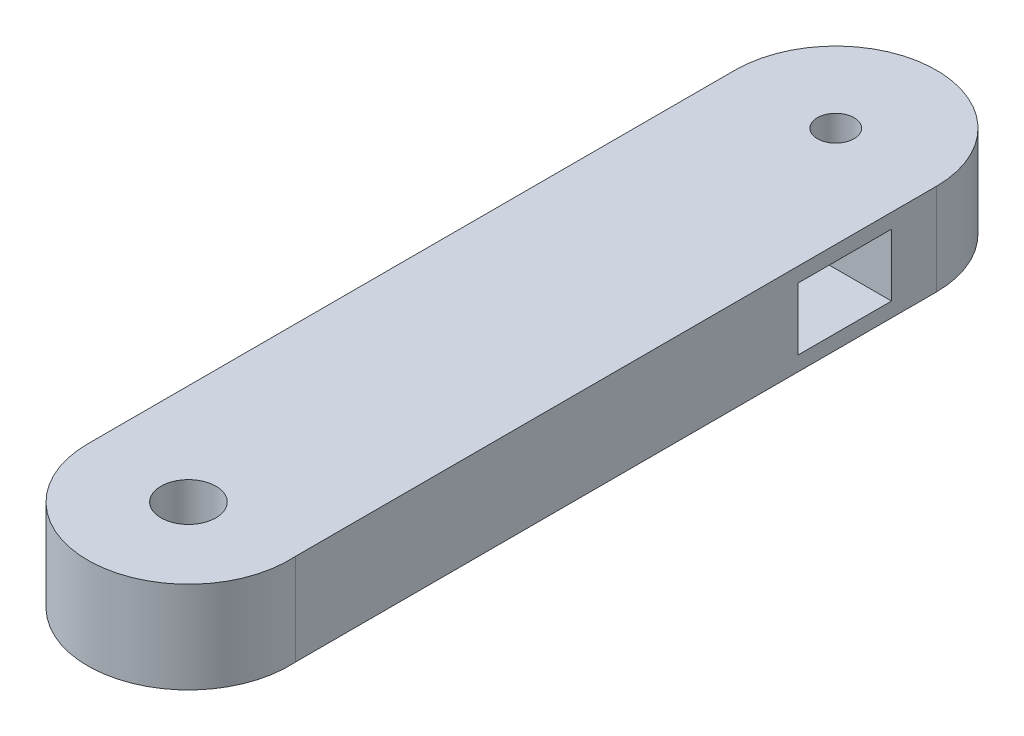
ISO-10303-21;
HEADER;
FILE_DESCRIPTION(('STEP AP214'),'2;1');
FILE_NAME('part.step','',(''),(''),'','','');
FILE_SCHEMA(('AUTOMOTIVE_DESIGN { 1 0 10303 214 1 1 1 1 }'));
ENDSEC;
DATA;
#1=APPLICATION_CONTEXT('core data for automotive mechanical design processes');
#2=APPLICATION_PROTOCOL_DEFINITION('international standard','automotive_design',2000,#1);
#3=PRODUCT_CONTEXT('',#1,'mechanical');
#4=PRODUCT('Part','Part','',(#3));
#5=PRODUCT_RELATED_PRODUCT_CATEGORY('part','',(#4));
#6=PRODUCT_DEFINITION_FORMATION('','',#4);
#7=PRODUCT_DEFINITION_CONTEXT('part definition',#1,'design');
#8=PRODUCT_DEFINITION('design','',#6,#7);
#9=PRODUCT_DEFINITION_SHAPE('','',#8);
#10=(LENGTH_UNIT() NAMED_UNIT(*) SI_UNIT(.MILLI.,.METRE.));
#11=(NAMED_UNIT(*) PLANE_ANGLE_UNIT() SI_UNIT($,.RADIAN.));
#12=(NAMED_UNIT(*) SI_UNIT($,.STERADIAN.) SOLID_ANGLE_UNIT());
#13=UNCERTAINTY_MEASURE_WITH_UNIT(LENGTH_MEASURE(1.E-05),#10,'distance_accuracy_value','');
#14=(GEOMETRIC_REPRESENTATION_CONTEXT(3) GLOBAL_UNCERTAINTY_ASSIGNED_CONTEXT((#13)) GLOBAL_UNIT_ASSIGNED_CONTEXT((#10,
#11,#12)) REPRESENTATION_CONTEXT('',''));
#15=CARTESIAN_POINT('',(0.,0.,0.));
#16=DIRECTION('',(0.,0.,1.));
#17=DIRECTION('',(1.,0.,0.));
#18=AXIS2_PLACEMENT_3D('',#15,#16,#17);
#19=CARTESIAN_POINT('',(0.,0.,0.));
#20=DIRECTION('',(0.,-1.,0.));
#21=DIRECTION('',(0.,0.,-1.));
#22=AXIS2_PLACEMENT_3D('',#19,#20,#21);
#23=CYLINDRICAL_SURFACE('',#22,5.5);
#24=CARTESIAN_POINT('',(0.,0.,0.));
#25=DIRECTION('',(0.,-1.,0.));
#26=DIRECTION('',(0.,0.,-1.));
#27=AXIS2_PLACEMENT_3D('',#24,#25,#26);
#28=CIRCLE('',#27,5.5);
#29=CARTESIAN_POINT('',(5.48924730154326,0.,-0.343750000000009));
#30=VERTEX_POINT('',#29);
#31=CARTESIAN_POINT('',(-5.5,0.,0.));
#32=VERTEX_POINT('',#31);
#33=EDGE_CURVE('E11',#30,#32,#28,.T.);
#34=ORIENTED_EDGE('',*,*,#33,.F.);
#35=DIRECTION('',(0.,-1.,0.));
#36=VECTOR('',#35,1.);
#37=CARTESIAN_POINT('',(5.48924730154326,47.2910902991932,-0.34375));
#38=LINE('',#37,#36);
#39=CARTESIAN_POINT('',(5.48924730154326,5.,-0.34375));
#40=VERTEX_POINT('',#39);
#41=EDGE_CURVE('E152',#40,#30,#38,.T.);
#42=ORIENTED_EDGE('',*,*,#41,.F.);
#43=CARTESIAN_POINT('',(0.,5.,0.));
#44=DIRECTION('',(0.,-1.,0.));
#45=DIRECTION('',(0.,0.,-1.));
#46=AXIS2_PLACEMENT_3D('',#43,#44,#45);
#47=CIRCLE('',#46,5.5);
#48=CARTESIAN_POINT('',(-5.5,5.,0.));
#49=VERTEX_POINT('',#48);
#50=EDGE_CURVE('E43',#40,#49,#47,.T.);
#51=ORIENTED_EDGE('',*,*,#50,.T.);
#52=DIRECTION('',(0.,-1.,0.));
#53=VECTOR('',#52,1.);
#54=CARTESIAN_POINT('',(-5.5,47.2910902991932,0.));
#55=LINE('',#54,#53);
#56=EDGE_CURVE('E148',#49,#32,#55,.T.);
#57=ORIENTED_EDGE('',*,*,#56,.T.);
#58=EDGE_LOOP('',(#34,#42,#51,#57));
#59=FACE_BOUND('',#58,.T.);
#60=ADVANCED_FACE('F34',(#59),#23,.T.);
#61=CARTESIAN_POINT('',(-2.4,0.,0.));
#62=DIRECTION('',(0.,1.,0.));
#63=DIRECTION('',(0.,0.,1.));
#64=AXIS2_PLACEMENT_3D('',#61,#62,#63);
#65=PLANE('',#64);
#66=CARTESIAN_POINT('',(-0.00537634922836809,0.,-35.34375));
#67=DIRECTION('',(0.,1.,0.));
#68=DIRECTION('',(0.,0.,1.));
#69=AXIS2_PLACEMENT_3D('',#66,#67,#68);
#70=CIRCLE('',#69,1.);
#71=CARTESIAN_POINT('',(-0.00537634922836809,0.,-34.34375));
#72=VERTEX_POINT('',#71);
#73=EDGE_CURVE('E38',#72,#72,#70,.F.);
#74=ORIENTED_EDGE('',*,*,#73,.F.);
#75=EDGE_LOOP('',(#74));
#76=FACE_BOUND('',#75,.T.);
#77=CARTESIAN_POINT('',(0.,0.,0.));
#78=DIRECTION('',(0.,-1.,0.));
#79=DIRECTION('',(0.,0.,-1.));
#80=AXIS2_PLACEMENT_3D('',#77,#78,#79);
#81=CIRCLE('',#80,1.5);
#82=CARTESIAN_POINT('',(0.,0.,-1.5));
#83=VERTEX_POINT('',#82);
#84=EDGE_CURVE('E163',#83,#83,#81,.T.);
#85=ORIENTED_EDGE('',*,*,#84,.F.);
#86=EDGE_LOOP('',(#85));
#87=FACE_BOUND('',#86,.T.);
#88=ORIENTED_EDGE('',*,*,#33,.T.);
#89=DIRECTION('',(0.,0.,1.));
#90=VECTOR('',#89,1.);
#91=CARTESIAN_POINT('',(-5.5,0.,0.));
#92=LINE('',#91,#90);
#93=CARTESIAN_POINT('',(-5.5,0.,-35.34375));
#94=VERTEX_POINT('',#93);
#95=EDGE_CURVE('E139',#94,#32,#92,.T.);
#96=ORIENTED_EDGE('',*,*,#95,.F.);
#97=CARTESIAN_POINT('',(-0.00537634922836809,0.,-35.34375));
#98=DIRECTION('',(0.,1.,0.));
#99=DIRECTION('',(0.,0.,1.));
#100=AXIS2_PLACEMENT_3D('',#97,#98,#99);
#101=CIRCLE('',#100,5.49462365077163);
#102=CARTESIAN_POINT('',(5.48924730154326,0.,-35.34375));
#103=VERTEX_POINT('',#102);
#104=EDGE_CURVE('E136',#103,#94,#101,.T.);
#105=ORIENTED_EDGE('',*,*,#104,.F.);
#106=DIRECTION('',(0.,0.,-1.));
#107=VECTOR('',#106,1.);
#108=CARTESIAN_POINT('',(5.48924730154326,0.,-0.34375));
#109=LINE('',#108,#107);
#110=EDGE_CURVE('E140',#30,#103,#109,.T.);
#111=ORIENTED_EDGE('',*,*,#110,.F.);
#112=EDGE_LOOP('',(#88,#96,#105,#111));
#113=FACE_BOUND('',#112,.T.);
#114=ADVANCED_FACE('F36',(#76,#87,#113),#65,.F.);
#115=CARTESIAN_POINT('',(-4.25,5.,0.));
#116=DIRECTION('',(0.,-1.,0.));
#117=DIRECTION('',(0.,0.,-1.));
#118=AXIS2_PLACEMENT_3D('',#115,#116,#117);
#119=PLANE('',#118);
#120=CARTESIAN_POINT('',(-0.00537634922836809,5.,-35.34375));
#121=DIRECTION('',(0.,-1.,0.));
#122=DIRECTION('',(0.,0.,-1.));
#123=AXIS2_PLACEMENT_3D('',#120,#121,#122);
#124=CIRCLE('',#123,1.);
#125=CARTESIAN_POINT('',(-0.00537634922836809,5.,-36.34375));
#126=VERTEX_POINT('',#125);
#127=EDGE_CURVE('E143',#126,#126,#124,.T.);
#128=ORIENTED_EDGE('',*,*,#127,.T.);
#129=EDGE_LOOP('',(#128));
#130=FACE_BOUND('',#129,.T.);
#131=ORIENTED_EDGE('',*,*,#50,.F.);
#132=DIRECTION('',(0.,0.,-1.));
#133=VECTOR('',#132,1.);
#134=CARTESIAN_POINT('',(5.48924730154326,5.,-0.34375));
#135=LINE('',#134,#133);
#136=CARTESIAN_POINT('',(5.48924730154326,5.,-35.34375));
#137=VERTEX_POINT('',#136);
#138=EDGE_CURVE('E151',#40,#137,#135,.T.);
#139=ORIENTED_EDGE('',*,*,#138,.T.);
#140=CARTESIAN_POINT('',(-0.00537634922836809,5.,-35.34375));
#141=DIRECTION('',(0.,-1.,0.));
#142=DIRECTION('',(0.,0.,-1.));
#143=AXIS2_PLACEMENT_3D('',#140,#141,#142);
#144=CIRCLE('',#143,5.49462365077163);
#145=CARTESIAN_POINT('',(-5.5,5.00000000000001,-35.34375));
#146=VERTEX_POINT('',#145);
#147=EDGE_CURVE('E149',#137,#146,#144,.F.);
#148=ORIENTED_EDGE('',*,*,#147,.T.);
#149=DIRECTION('',(0.,0.,1.));
#150=VECTOR('',#149,1.);
#151=CARTESIAN_POINT('',(-5.5,5.,0.));
#152=LINE('',#151,#150);
#153=EDGE_CURVE('E154',#146,#49,#152,.T.);
#154=ORIENTED_EDGE('',*,*,#153,.T.);
#155=EDGE_LOOP('',(#131,#139,#148,#154));
#156=FACE_BOUND('',#155,.T.);
#157=CARTESIAN_POINT('',(0.,5.,0.));
#158=DIRECTION('',(0.,-1.,0.));
#159=DIRECTION('',(0.,0.,-1.));
#160=AXIS2_PLACEMENT_3D('',#157,#158,#159);
#161=CIRCLE('',#160,1.5);
#162=CARTESIAN_POINT('',(0.,5.,-1.5));
#163=VERTEX_POINT('',#162);
#164=EDGE_CURVE('E166',#163,#163,#161,.T.);
#165=ORIENTED_EDGE('',*,*,#164,.T.);
#166=EDGE_LOOP('',(#165));
#167=FACE_BOUND('',#166,.T.);
#168=ADVANCED_FACE('F176',(#130,#156,#167),#119,.F.);
#169=CARTESIAN_POINT('',(0.,0.,0.));
#170=DIRECTION('',(0.,-1.,0.));
#171=DIRECTION('',(0.,0.,-1.));
#172=AXIS2_PLACEMENT_3D('',#169,#170,#171);
#173=CYLINDRICAL_SURFACE('',#172,1.5);
#174=ORIENTED_EDGE('',*,*,#164,.F.);
#175=EDGE_LOOP('',(#174));
#176=FACE_BOUND('',#175,.T.);
#177=ORIENTED_EDGE('',*,*,#84,.T.);
#178=EDGE_LOOP('',(#177));
#179=FACE_BOUND('',#178,.T.);
#180=ADVANCED_FACE('F190',(#176,#179),#173,.F.);
#181=CARTESIAN_POINT('',(5.48924730154326,47.2910902991932,-0.34375));
#182=DIRECTION('',(1.,0.,0.));
#183=DIRECTION('',(0.,0.,-1.));
#184=AXIS2_PLACEMENT_3D('',#181,#182,#183);
#185=PLANE('',#184);
#186=DIRECTION('',(0.,-1.,0.));
#187=VECTOR('',#186,1.);
#188=CARTESIAN_POINT('',(5.48924730154326,4.19999999999999,-27.79375));
#189=LINE('',#188,#187);
#190=CARTESIAN_POINT('',(5.48924730154326,4.19999999999999,-27.79375));
#191=VERTEX_POINT('',#190);
#192=CARTESIAN_POINT('',(5.48924730154326,0.799999999999997,-27.79375));
#193=VERTEX_POINT('',#192);
#194=EDGE_CURVE('E50',#191,#193,#189,.T.);
#195=ORIENTED_EDGE('',*,*,#194,.F.);
#196=DIRECTION('',(0.,0.,1.));
#197=VECTOR('',#196,1.);
#198=CARTESIAN_POINT('',(5.48924730154326,4.19999999999999,-32.89375));
#199=LINE('',#198,#197);
#200=CARTESIAN_POINT('',(5.48924730154326,4.19999999999999,-32.89375));
#201=VERTEX_POINT('',#200);
#202=EDGE_CURVE('E118',#201,#191,#199,.T.);
#203=ORIENTED_EDGE('',*,*,#202,.F.);
#204=DIRECTION('',(0.,1.,0.));
#205=VECTOR('',#204,1.);
#206=CARTESIAN_POINT('',(5.48924730154326,4.19999999999999,-32.89375));
#207=LINE('',#206,#205);
#208=CARTESIAN_POINT('',(5.48924730154326,0.799999999999993,-32.89375));
#209=VERTEX_POINT('',#208);
#210=EDGE_CURVE('E121',#209,#201,#207,.T.);
#211=ORIENTED_EDGE('',*,*,#210,.F.);
#212=DIRECTION('',(0.,0.,-1.));
#213=VECTOR('',#212,1.);
#214=CARTESIAN_POINT('',(5.48924730154326,0.799999999999993,-32.89375));
#215=LINE('',#214,#213);
#216=EDGE_CURVE('E127',#193,#209,#215,.T.);
#217=ORIENTED_EDGE('',*,*,#216,.F.);
#218=EDGE_LOOP('',(#195,#203,#211,#217));
#219=FACE_BOUND('',#218,.T.);
#220=ORIENTED_EDGE('',*,*,#138,.F.);
#221=ORIENTED_EDGE('',*,*,#41,.T.);
#222=ORIENTED_EDGE('',*,*,#110,.T.);
#223=DIRECTION('',(0.,-1.,0.));
#224=VECTOR('',#223,1.);
#225=CARTESIAN_POINT('',(5.48924730154326,47.2910902991932,-35.34375));
#226=LINE('',#225,#224);
#227=EDGE_CURVE('E156',#137,#103,#226,.T.);
#228=ORIENTED_EDGE('',*,*,#227,.F.);
#229=EDGE_LOOP('',(#220,#221,#222,#228));
#230=FACE_BOUND('',#229,.T.);
#231=ADVANCED_FACE('F188',(#219,#230),#185,.T.);
#232=CARTESIAN_POINT('',(-0.00537634922836809,47.2910902991932,-35.34375));
#233=DIRECTION('',(0.,-1.,0.));
#234=DIRECTION('',(0.,0.,-1.));
#235=AXIS2_PLACEMENT_3D('',#232,#233,#234);
#236=CYLINDRICAL_SURFACE('',#235,5.49462365077163);
#237=ORIENTED_EDGE('',*,*,#147,.F.);
#238=ORIENTED_EDGE('',*,*,#227,.T.);
#239=ORIENTED_EDGE('',*,*,#104,.T.);
#240=DIRECTION('',(0.,-1.,0.));
#241=VECTOR('',#240,1.);
#242=CARTESIAN_POINT('',(-5.5,47.2910902991932,-35.34375));
#243=LINE('',#242,#241);
#244=EDGE_CURVE('E158',#146,#94,#243,.T.);
#245=ORIENTED_EDGE('',*,*,#244,.F.);
#246=EDGE_LOOP('',(#237,#238,#239,#245));
#247=FACE_BOUND('',#246,.T.);
#248=ADVANCED_FACE('F185',(#247),#236,.T.);
#249=CARTESIAN_POINT('',(-5.5,47.2910902991932,0.));
#250=DIRECTION('',(-1.,0.,0.));
#251=DIRECTION('',(0.,0.,1.));
#252=AXIS2_PLACEMENT_3D('',#249,#250,#251);
#253=PLANE('',#252);
#254=DIRECTION('',(0.,-1.,0.));
#255=VECTOR('',#254,1.);
#256=CARTESIAN_POINT('',(-5.5,4.19999999999999,-27.79375));
#257=LINE('',#256,#255);
#258=CARTESIAN_POINT('',(-5.5,4.19999999999999,-27.79375));
#259=VERTEX_POINT('',#258);
#260=CARTESIAN_POINT('',(-5.5,0.799999999999993,-27.79375));
#261=VERTEX_POINT('',#260);
#262=EDGE_CURVE('E102',#259,#261,#257,.T.);
#263=ORIENTED_EDGE('',*,*,#262,.T.);
#264=DIRECTION('',(0.,0.,-1.));
#265=VECTOR('',#264,1.);
#266=CARTESIAN_POINT('',(-5.5,0.799999999999993,-32.89375));
#267=LINE('',#266,#265);
#268=CARTESIAN_POINT('',(-5.5,0.799999999999998,-32.89375));
#269=VERTEX_POINT('',#268);
#270=EDGE_CURVE('E111',#261,#269,#267,.T.);
#271=ORIENTED_EDGE('',*,*,#270,.T.);
#272=DIRECTION('',(0.,1.,0.));
#273=VECTOR('',#272,1.);
#274=CARTESIAN_POINT('',(-5.5,4.19999999999999,-32.89375));
#275=LINE('',#274,#273);
#276=CARTESIAN_POINT('',(-5.5,4.19999999999999,-32.89375));
#277=VERTEX_POINT('',#276);
#278=EDGE_CURVE('E58',#269,#277,#275,.T.);
#279=ORIENTED_EDGE('',*,*,#278,.T.);
#280=DIRECTION('',(0.,0.,1.));
#281=VECTOR('',#280,1.);
#282=CARTESIAN_POINT('',(-5.5,4.19999999999999,-32.89375));
#283=LINE('',#282,#281);
#284=EDGE_CURVE('E108',#277,#259,#283,.T.);
#285=ORIENTED_EDGE('',*,*,#284,.T.);
#286=EDGE_LOOP('',(#263,#271,#279,#285));
#287=FACE_BOUND('',#286,.T.);
#288=ORIENTED_EDGE('',*,*,#153,.F.);
#289=ORIENTED_EDGE('',*,*,#244,.T.);
#290=ORIENTED_EDGE('',*,*,#95,.T.);
#291=ORIENTED_EDGE('',*,*,#56,.F.);
#292=EDGE_LOOP('',(#288,#289,#290,#291));
#293=FACE_BOUND('',#292,.T.);
#294=ADVANCED_FACE('F115',(#287,#293),#253,.T.);
#295=CARTESIAN_POINT('',(-0.00537634922836809,7.,-35.34375));
#296=DIRECTION('',(0.,-1.,0.));
#297=DIRECTION('',(0.,0.,-1.));
#298=AXIS2_PLACEMENT_3D('',#295,#296,#297);
#299=CYLINDRICAL_SURFACE('',#298,1.);
#300=ORIENTED_EDGE('',*,*,#127,.F.);
#301=EDGE_LOOP('',(#300));
#302=FACE_BOUND('',#301,.T.);
#303=ORIENTED_EDGE('',*,*,#73,.T.);
#304=EDGE_LOOP('',(#303));
#305=FACE_BOUND('',#304,.T.);
#306=ADVANCED_FACE('F211',(#302,#305),#299,.F.);
#307=CARTESIAN_POINT('',(-5.5,4.19999999999999,-27.79375));
#308=DIRECTION('',(0.,0.,1.));
#309=DIRECTION('',(1.,0.,0.));
#310=AXIS2_PLACEMENT_3D('',#307,#308,#309);
#311=PLANE('',#310);
#312=ORIENTED_EDGE('',*,*,#194,.T.);
#313=DIRECTION('',(1.,0.,0.));
#314=VECTOR('',#313,1.);
#315=CARTESIAN_POINT('',(-5.5,0.799999999999993,-27.79375));
#316=LINE('',#315,#314);
#317=EDGE_CURVE('E98',#261,#193,#316,.T.);
#318=ORIENTED_EDGE('',*,*,#317,.F.);
#319=ORIENTED_EDGE('',*,*,#262,.F.);
#320=DIRECTION('',(1.,0.,0.));
#321=VECTOR('',#320,1.);
#322=CARTESIAN_POINT('',(-5.5,4.19999999999999,-27.79375));
#323=LINE('',#322,#321);
#324=EDGE_CURVE('E131',#259,#191,#323,.T.);
#325=ORIENTED_EDGE('',*,*,#324,.T.);
#326=EDGE_LOOP('',(#312,#318,#319,#325));
#327=FACE_BOUND('',#326,.T.);
#328=ADVANCED_FACE('F100',(#327),#311,.F.);
#329=CARTESIAN_POINT('',(-5.5,4.19999999999999,-32.89375));
#330=DIRECTION('',(0.,1.,0.));
#331=DIRECTION('',(0.,0.,1.));
#332=AXIS2_PLACEMENT_3D('',#329,#330,#331);
#333=PLANE('',#332);
#334=ORIENTED_EDGE('',*,*,#202,.T.);
#335=ORIENTED_EDGE('',*,*,#324,.F.);
#336=ORIENTED_EDGE('',*,*,#284,.F.);
#337=DIRECTION('',(1.,0.,0.));
#338=VECTOR('',#337,1.);
#339=CARTESIAN_POINT('',(-5.5,4.19999999999999,-32.89375));
#340=LINE('',#339,#338);
#341=EDGE_CURVE('E133',#277,#201,#340,.T.);
#342=ORIENTED_EDGE('',*,*,#341,.T.);
#343=EDGE_LOOP('',(#334,#335,#336,#342));
#344=FACE_BOUND('',#343,.T.);
#345=ADVANCED_FACE('F219',(#344),#333,.F.);
#346=CARTESIAN_POINT('',(-5.5,4.19999999999999,-32.89375));
#347=DIRECTION('',(0.,0.,-1.));
#348=DIRECTION('',(-1.,0.,0.));
#349=AXIS2_PLACEMENT_3D('',#346,#347,#348);
#350=PLANE('',#349);
#351=ORIENTED_EDGE('',*,*,#210,.T.);
#352=ORIENTED_EDGE('',*,*,#341,.F.);
#353=ORIENTED_EDGE('',*,*,#278,.F.);
#354=DIRECTION('',(1.,0.,0.));
#355=VECTOR('',#354,1.);
#356=CARTESIAN_POINT('',(-5.5,0.799999999999993,-32.89375));
#357=LINE('',#356,#355);
#358=EDGE_CURVE('E107',#269,#209,#357,.T.);
#359=ORIENTED_EDGE('',*,*,#358,.T.);
#360=EDGE_LOOP('',(#351,#352,#353,#359));
#361=FACE_BOUND('',#360,.T.);
#362=ADVANCED_FACE('F226',(#361),#350,.F.);
#363=CARTESIAN_POINT('',(-5.5,0.799999999999993,-32.89375));
#364=DIRECTION('',(0.,-1.,0.));
#365=DIRECTION('',(0.,0.,-1.));
#366=AXIS2_PLACEMENT_3D('',#363,#364,#365);
#367=PLANE('',#366);
#368=ORIENTED_EDGE('',*,*,#216,.T.);
#369=ORIENTED_EDGE('',*,*,#358,.F.);
#370=ORIENTED_EDGE('',*,*,#270,.F.);
#371=ORIENTED_EDGE('',*,*,#317,.T.);
#372=EDGE_LOOP('',(#368,#369,#370,#371));
#373=FACE_BOUND('',#372,.T.);
#374=ADVANCED_FACE('F112',(#373),#367,.F.);
#375=CLOSED_SHELL('',(#60,#114,#168,#180,#231,#248,#294,#306,#328,#345,#362,#374));
#376=MANIFOLD_SOLID_BREP('B2',#375);
#377=ADVANCED_BREP_SHAPE_REPRESENTATION('',(#18,#376),#14);
#378=SHAPE_DEFINITION_REPRESENTATION(#9,#377);
ENDSEC;
END-ISO-10303-21;
